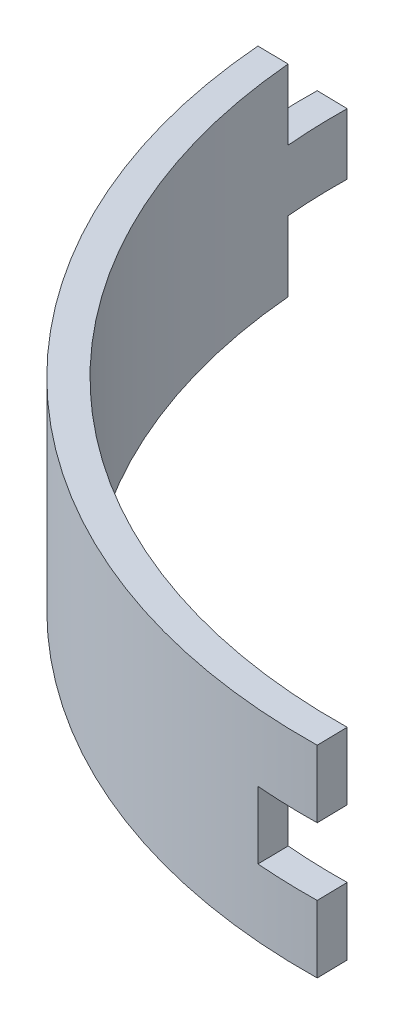
ISO-10303-21;
HEADER;
FILE_DESCRIPTION(('STEP AP214'),'2;1');
FILE_NAME('part.step','',(''),(''),'','','');
FILE_SCHEMA(('AUTOMOTIVE_DESIGN { 1 0 10303 214 1 1 1 1 }'));
ENDSEC;
DATA;
#1=APPLICATION_CONTEXT('core data for automotive mechanical design processes');
#2=APPLICATION_PROTOCOL_DEFINITION('international standard','automotive_design',2000,#1);
#3=PRODUCT_CONTEXT('',#1,'mechanical');
#4=PRODUCT('Part','Part','',(#3));
#5=PRODUCT_RELATED_PRODUCT_CATEGORY('part','',(#4));
#6=PRODUCT_DEFINITION_FORMATION('','',#4);
#7=PRODUCT_DEFINITION_CONTEXT('part definition',#1,'design');
#8=PRODUCT_DEFINITION('design','',#6,#7);
#9=PRODUCT_DEFINITION_SHAPE('','',#8);
#10=(LENGTH_UNIT() NAMED_UNIT(*) SI_UNIT(.MILLI.,.METRE.));
#11=(NAMED_UNIT(*) PLANE_ANGLE_UNIT() SI_UNIT($,.RADIAN.));
#12=(NAMED_UNIT(*) SI_UNIT($,.STERADIAN.) SOLID_ANGLE_UNIT());
#13=UNCERTAINTY_MEASURE_WITH_UNIT(LENGTH_MEASURE(1.E-05),#10,'distance_accuracy_value','');
#14=(GEOMETRIC_REPRESENTATION_CONTEXT(3) GLOBAL_UNCERTAINTY_ASSIGNED_CONTEXT((#13)) GLOBAL_UNIT_ASSIGNED_CONTEXT((#10,
#11,#12)) REPRESENTATION_CONTEXT('',''));
#15=CARTESIAN_POINT('',(0.,0.,0.));
#16=DIRECTION('',(0.,0.,1.));
#17=DIRECTION('',(1.,0.,0.));
#18=AXIS2_PLACEMENT_3D('',#15,#16,#17);
#19=CARTESIAN_POINT('',(0.,33.,0.));
#20=DIRECTION('',(0.,-1.,0.));
#21=DIRECTION('',(0.,0.,-1.));
#22=AXIS2_PLACEMENT_3D('',#19,#20,#21);
#23=CYLINDRICAL_SURFACE('',#22,102.5);
#24=DIRECTION('',(0.,-1.,0.));
#25=VECTOR('',#24,1.);
#26=CARTESIAN_POINT('',(-102.169415604373,33.,8.22560119753821));
#27=LINE('',#26,#25);
#28=CARTESIAN_POINT('',(-102.169415604373,33.,8.22560119753821));
#29=VERTEX_POINT('',#28);
#30=CARTESIAN_POINT('',(-102.169415604373,21.5,8.22560119753821));
#31=VERTEX_POINT('',#30);
#32=EDGE_CURVE('E45',#29,#31,#27,.T.);
#33=ORIENTED_EDGE('',*,*,#32,.T.);
#34=CARTESIAN_POINT('',(0.,21.5,0.));
#35=DIRECTION('',(0.,-1.,0.));
#36=DIRECTION('',(0.,0.,-1.));
#37=AXIS2_PLACEMENT_3D('',#34,#35,#36);
#38=CIRCLE('',#37,102.5);
#39=CARTESIAN_POINT('',(-102.48438875353,21.5,-1.78887165982112));
#40=VERTEX_POINT('',#39);
#41=EDGE_CURVE('E130',#31,#40,#38,.T.);
#42=ORIENTED_EDGE('',*,*,#41,.T.);
#43=DIRECTION('',(0.,-1.,0.));
#44=VECTOR('',#43,1.);
#45=CARTESIAN_POINT('',(-102.48438875353,33.,-1.78887165982112));
#46=LINE('',#45,#44);
#47=CARTESIAN_POINT('',(-102.48438875353,11.5,-1.78887165982112));
#48=VERTEX_POINT('',#47);
#49=EDGE_CURVE('E138',#40,#48,#46,.T.);
#50=ORIENTED_EDGE('',*,*,#49,.T.);
#51=CARTESIAN_POINT('',(0.,11.5,0.));
#52=DIRECTION('',(0.,-1.,0.));
#53=DIRECTION('',(0.,0.,-1.));
#54=AXIS2_PLACEMENT_3D('',#51,#52,#53);
#55=CIRCLE('',#54,102.5);
#56=CARTESIAN_POINT('',(-102.169415604373,11.5,8.22560119753821));
#57=VERTEX_POINT('',#56);
#58=EDGE_CURVE('E178',#57,#48,#55,.T.);
#59=ORIENTED_EDGE('',*,*,#58,.F.);
#60=DIRECTION('',(0.,-1.,0.));
#61=VECTOR('',#60,1.);
#62=CARTESIAN_POINT('',(-102.169415604373,33.,8.22560119753821));
#63=LINE('',#62,#61);
#64=CARTESIAN_POINT('',(-102.169415604373,0.,8.22560119753821));
#65=VERTEX_POINT('',#64);
#66=EDGE_CURVE('E167',#65,#57,#63,.F.);
#67=ORIENTED_EDGE('',*,*,#66,.F.);
#68=CARTESIAN_POINT('',(0.,0.,0.));
#69=DIRECTION('',(0.,1.,0.));
#70=DIRECTION('',(0.,0.,1.));
#71=AXIS2_PLACEMENT_3D('',#68,#69,#70);
#72=CIRCLE('',#71,102.5);
#73=CARTESIAN_POINT('',(1.78887165982157,0.,102.48438875353));
#74=VERTEX_POINT('',#73);
#75=EDGE_CURVE('E175',#65,#74,#72,.T.);
#76=ORIENTED_EDGE('',*,*,#75,.T.);
#77=DIRECTION('',(0.,-1.,0.));
#78=VECTOR('',#77,1.);
#79=CARTESIAN_POINT('',(1.78887165982157,33.,102.48438875353));
#80=LINE('',#79,#78);
#81=CARTESIAN_POINT('',(1.78887165982171,11.,102.48438875353));
#82=VERTEX_POINT('',#81);
#83=EDGE_CURVE('E154',#82,#74,#80,.T.);
#84=ORIENTED_EDGE('',*,*,#83,.F.);
#85=CARTESIAN_POINT('',(0.,11.,0.));
#86=DIRECTION('',(0.,1.,0.));
#87=DIRECTION('',(0.,0.,1.));
#88=AXIS2_PLACEMENT_3D('',#85,#86,#87);
#89=CIRCLE('',#88,102.5);
#90=CARTESIAN_POINT('',(-8.21813901558994,11.,102.170016106099));
#91=VERTEX_POINT('',#90);
#92=EDGE_CURVE('E189',#91,#82,#89,.T.);
#93=ORIENTED_EDGE('',*,*,#92,.F.);
#94=DIRECTION('',(0.,-1.,0.));
#95=VECTOR('',#94,1.);
#96=CARTESIAN_POINT('',(-8.21813901558994,33.,102.170016106099));
#97=LINE('',#96,#95);
#98=CARTESIAN_POINT('',(-8.21813901558994,22.,102.170016106099));
#99=VERTEX_POINT('',#98);
#100=EDGE_CURVE('E202',#99,#91,#97,.T.);
#101=ORIENTED_EDGE('',*,*,#100,.F.);
#102=CARTESIAN_POINT('',(0.,22.,0.));
#103=DIRECTION('',(0.,1.,0.));
#104=DIRECTION('',(0.,0.,1.));
#105=AXIS2_PLACEMENT_3D('',#102,#103,#104);
#106=CIRCLE('',#105,102.5);
#107=CARTESIAN_POINT('',(1.78887165982171,22.,102.48438875353));
#108=VERTEX_POINT('',#107);
#109=EDGE_CURVE('E184',#99,#108,#106,.T.);
#110=ORIENTED_EDGE('',*,*,#109,.T.);
#111=CARTESIAN_POINT('',(1.78887165982157,33.,102.48438875353));
#112=VERTEX_POINT('',#111);
#113=EDGE_CURVE('E155',#112,#108,#80,.T.);
#114=ORIENTED_EDGE('',*,*,#113,.F.);
#115=CARTESIAN_POINT('',(0.,33.,0.));
#116=DIRECTION('',(0.,1.,0.));
#117=DIRECTION('',(0.,0.,1.));
#118=AXIS2_PLACEMENT_3D('',#115,#116,#117);
#119=CIRCLE('',#118,102.5);
#120=EDGE_CURVE('E193',#29,#112,#119,.T.);
#121=ORIENTED_EDGE('',*,*,#120,.F.);
#122=EDGE_LOOP('',(#33,#42,#50,#59,#67,#76,#84,#93,#101,#110,#114,#121));
#123=FACE_BOUND('',#122,.T.);
#124=ADVANCED_FACE('F32',(#123),#23,.T.);
#125=CARTESIAN_POINT('',(0.,33.,0.));
#126=DIRECTION('',(0.,-1.,0.));
#127=DIRECTION('',(0.,0.,-1.));
#128=AXIS2_PLACEMENT_3D('',#125,#126,#127);
#129=CYLINDRICAL_SURFACE('',#128,97.5);
#130=CARTESIAN_POINT('',(0.,21.5,0.));
#131=DIRECTION('',(0.,-1.,0.));
#132=DIRECTION('',(0.,0.,-1.));
#133=AXIS2_PLACEMENT_3D('',#130,#131,#132);
#134=CIRCLE('',#133,97.5);
#135=CARTESIAN_POINT('',(-97.1449380063492,21.5,8.31330378024206));
#136=VERTEX_POINT('',#135);
#137=CARTESIAN_POINT('',(-97.4851502777482,21.5,-1.70160962763472));
#138=VERTEX_POINT('',#137);
#139=EDGE_CURVE('E121',#136,#138,#134,.T.);
#140=ORIENTED_EDGE('',*,*,#139,.F.);
#141=DIRECTION('',(0.,-1.,0.));
#142=VECTOR('',#141,1.);
#143=CARTESIAN_POINT('',(-97.1449380063492,33.,8.31330378024207));
#144=LINE('',#143,#142);
#145=CARTESIAN_POINT('',(-97.1449380063492,33.,8.31330378024206));
#146=VERTEX_POINT('',#145);
#147=EDGE_CURVE('E139',#146,#136,#144,.T.);
#148=ORIENTED_EDGE('',*,*,#147,.F.);
#149=CARTESIAN_POINT('',(0.,33.,0.));
#150=DIRECTION('',(0.,1.,0.));
#151=DIRECTION('',(0.,0.,1.));
#152=AXIS2_PLACEMENT_3D('',#149,#150,#151);
#153=CIRCLE('',#152,97.5);
#154=CARTESIAN_POINT('',(1.70160962763512,33.,97.4851502777482));
#155=VERTEX_POINT('',#154);
#156=EDGE_CURVE('E149',#146,#155,#153,.T.);
#157=ORIENTED_EDGE('',*,*,#156,.T.);
#158=DIRECTION('',(0.,-1.,0.));
#159=VECTOR('',#158,1.);
#160=CARTESIAN_POINT('',(1.70160962763512,33.,97.4851502777482));
#161=LINE('',#160,#159);
#162=CARTESIAN_POINT('',(1.70160962763528,22.,97.4851502777482));
#163=VERTEX_POINT('',#162);
#164=EDGE_CURVE('E147',#155,#163,#161,.T.);
#165=ORIENTED_EDGE('',*,*,#164,.T.);
#166=CARTESIAN_POINT('',(0.,22.,0.));
#167=DIRECTION('',(0.,1.,0.));
#168=DIRECTION('',(0.,0.,1.));
#169=AXIS2_PLACEMENT_3D('',#166,#167,#168);
#170=CIRCLE('',#169,97.5);
#171=CARTESIAN_POINT('',(-8.30584093758575,22.,97.1455763600152));
#172=VERTEX_POINT('',#171);
#173=EDGE_CURVE('E164',#172,#163,#170,.T.);
#174=ORIENTED_EDGE('',*,*,#173,.F.);
#175=DIRECTION('',(0.,-1.,0.));
#176=VECTOR('',#175,1.);
#177=CARTESIAN_POINT('',(-8.30584093758575,33.,97.1455763600152));
#178=LINE('',#177,#176);
#179=CARTESIAN_POINT('',(-8.30584093758575,11.,97.1455763600152));
#180=VERTEX_POINT('',#179);
#181=EDGE_CURVE('E158',#172,#180,#178,.T.);
#182=ORIENTED_EDGE('',*,*,#181,.T.);
#183=CARTESIAN_POINT('',(0.,11.,0.));
#184=DIRECTION('',(0.,1.,0.));
#185=DIRECTION('',(0.,0.,1.));
#186=AXIS2_PLACEMENT_3D('',#183,#184,#185);
#187=CIRCLE('',#186,97.5);
#188=CARTESIAN_POINT('',(1.70160962763528,11.,97.4851502777482));
#189=VERTEX_POINT('',#188);
#190=EDGE_CURVE('E161',#180,#189,#187,.T.);
#191=ORIENTED_EDGE('',*,*,#190,.T.);
#192=CARTESIAN_POINT('',(1.70160962763512,0.,97.4851502777482));
#193=VERTEX_POINT('',#192);
#194=EDGE_CURVE('E144',#189,#193,#161,.T.);
#195=ORIENTED_EDGE('',*,*,#194,.T.);
#196=CARTESIAN_POINT('',(0.,0.,0.));
#197=DIRECTION('',(0.,1.,0.));
#198=DIRECTION('',(0.,0.,1.));
#199=AXIS2_PLACEMENT_3D('',#196,#197,#198);
#200=CIRCLE('',#199,97.5);
#201=CARTESIAN_POINT('',(-97.1449380063492,0.,8.31330378024207));
#202=VERTEX_POINT('',#201);
#203=EDGE_CURVE('E186',#202,#193,#200,.T.);
#204=ORIENTED_EDGE('',*,*,#203,.F.);
#205=DIRECTION('',(0.,-1.,0.));
#206=VECTOR('',#205,1.);
#207=CARTESIAN_POINT('',(-97.1449380063492,33.,8.31330378024206));
#208=LINE('',#207,#206);
#209=CARTESIAN_POINT('',(-97.1449380063492,11.5,8.31330378024206));
#210=VERTEX_POINT('',#209);
#211=EDGE_CURVE('E53',#202,#210,#208,.F.);
#212=ORIENTED_EDGE('',*,*,#211,.T.);
#213=CARTESIAN_POINT('',(0.,11.5,0.));
#214=DIRECTION('',(0.,-1.,0.));
#215=DIRECTION('',(0.,0.,-1.));
#216=AXIS2_PLACEMENT_3D('',#213,#214,#215);
#217=CIRCLE('',#216,97.5);
#218=CARTESIAN_POINT('',(-97.4851502777482,11.5,-1.70160962763472));
#219=VERTEX_POINT('',#218);
#220=EDGE_CURVE('E143',#210,#219,#217,.T.);
#221=ORIENTED_EDGE('',*,*,#220,.T.);
#222=DIRECTION('',(0.,-1.,0.));
#223=VECTOR('',#222,1.);
#224=CARTESIAN_POINT('',(-97.4851502777482,33.,-1.70160962763472));
#225=LINE('',#224,#223);
#226=EDGE_CURVE('E136',#138,#219,#225,.T.);
#227=ORIENTED_EDGE('',*,*,#226,.F.);
#228=EDGE_LOOP('',(#140,#148,#157,#165,#174,#182,#191,#195,#204,#212,#221,#227));
#229=FACE_BOUND('',#228,.T.);
#230=ADVANCED_FACE('F142',(#229),#129,.F.);
#231=CARTESIAN_POINT('',(-97.4851502777482,33.,-1.70160962763472));
#232=DIRECTION('',(-0.0174524064372792,0.,0.999847695156391));
#233=DIRECTION('',(0.999847695156391,0.,0.0174524064372792));
#234=AXIS2_PLACEMENT_3D('',#231,#232,#233);
#235=PLANE('',#234);
#236=ORIENTED_EDGE('',*,*,#49,.F.);
#237=DIRECTION('',(-0.999847695156391,0.,-0.0174524064372792));
#238=VECTOR('',#237,1.);
#239=CARTESIAN_POINT('',(-94.0318288913808,21.5,-1.64133167861769));
#240=LINE('',#239,#238);
#241=EDGE_CURVE('E124',#138,#40,#240,.T.);
#242=ORIENTED_EDGE('',*,*,#241,.F.);
#243=ORIENTED_EDGE('',*,*,#226,.T.);
#244=DIRECTION('',(-0.999847695156391,0.,-0.0174524064372792));
#245=VECTOR('',#244,1.);
#246=CARTESIAN_POINT('',(0.,11.5,0.));
#247=LINE('',#246,#245);
#248=EDGE_CURVE('E219',#219,#48,#247,.T.);
#249=ORIENTED_EDGE('',*,*,#248,.T.);
#250=EDGE_LOOP('',(#236,#242,#243,#249));
#251=FACE_BOUND('',#250,.T.);
#252=ADVANCED_FACE('F134',(#251),#235,.F.);
#253=CARTESIAN_POINT('',(0.,0.,0.));
#254=DIRECTION('',(0.,1.,0.));
#255=DIRECTION('',(0.,0.,1.));
#256=AXIS2_PLACEMENT_3D('',#253,#254,#255);
#257=PLANE('',#256);
#258=DIRECTION('',(-0.999847695156391,0.,-0.0174524064372792));
#259=VECTOR('',#258,1.);
#260=CARTESIAN_POINT('',(-0.174654094665217,0.,10.0059263820278));
#261=LINE('',#260,#259);
#262=EDGE_CURVE('E39',#202,#65,#261,.T.);
#263=ORIENTED_EDGE('',*,*,#262,.F.);
#264=ORIENTED_EDGE('',*,*,#203,.T.);
#265=DIRECTION('',(-0.017452406437285,0.,-0.999847695156391));
#266=VECTOR('',#265,1.);
#267=CARTESIAN_POINT('',(1.78887165982157,0.,102.48438875353));
#268=LINE('',#267,#266);
#269=EDGE_CURVE('E183',#74,#193,#268,.T.);
#270=ORIENTED_EDGE('',*,*,#269,.F.);
#271=ORIENTED_EDGE('',*,*,#75,.F.);
#272=EDGE_LOOP('',(#263,#264,#270,#271));
#273=FACE_BOUND('',#272,.T.);
#274=ADVANCED_FACE('F181',(#273),#257,.F.);
#275=CARTESIAN_POINT('',(1.78887165982157,33.,102.48438875353));
#276=DIRECTION('',(-0.999847695156391,0.,0.017452406437285));
#277=DIRECTION('',(0.017452406437285,0.,0.999847695156391));
#278=AXIS2_PLACEMENT_3D('',#275,#276,#277);
#279=PLANE('',#278);
#280=DIRECTION('',(0.017452406437285,0.,0.999847695156391));
#281=VECTOR('',#280,1.);
#282=CARTESIAN_POINT('',(1.65626004977408,11.,94.8870747021088));
#283=LINE('',#282,#281);
#284=EDGE_CURVE('E205',#189,#82,#283,.T.);
#285=ORIENTED_EDGE('',*,*,#284,.T.);
#286=ORIENTED_EDGE('',*,*,#83,.T.);
#287=ORIENTED_EDGE('',*,*,#269,.T.);
#288=ORIENTED_EDGE('',*,*,#194,.F.);
#289=EDGE_LOOP('',(#285,#286,#287,#288));
#290=FACE_BOUND('',#289,.T.);
#291=ADVANCED_FACE('F246',(#290),#279,.F.);
#292=ORIENTED_EDGE('',*,*,#113,.T.);
#293=DIRECTION('',(0.017452406437285,0.,0.999847695156391));
#294=VECTOR('',#293,1.);
#295=CARTESIAN_POINT('',(1.65626004977408,22.,94.8870747021088));
#296=LINE('',#295,#294);
#297=EDGE_CURVE('E209',#163,#108,#296,.T.);
#298=ORIENTED_EDGE('',*,*,#297,.F.);
#299=ORIENTED_EDGE('',*,*,#164,.F.);
#300=DIRECTION('',(-0.017452406437285,0.,-0.999847695156391));
#301=VECTOR('',#300,1.);
#302=CARTESIAN_POINT('',(1.78887165982157,33.,102.48438875353));
#303=LINE('',#302,#301);
#304=EDGE_CURVE('E194',#112,#155,#303,.T.);
#305=ORIENTED_EDGE('',*,*,#304,.F.);
#306=EDGE_LOOP('',(#292,#298,#299,#305));
#307=FACE_BOUND('',#306,.T.);
#308=ADVANCED_FACE('F230',(#307),#279,.F.);
#309=CARTESIAN_POINT('',(0.,33.,0.));
#310=DIRECTION('',(0.,1.,0.));
#311=DIRECTION('',(0.,0.,1.));
#312=AXIS2_PLACEMENT_3D('',#309,#310,#311);
#313=PLANE('',#312);
#314=DIRECTION('',(0.999847695156391,0.,0.0174524064372792));
#315=VECTOR('',#314,1.);
#316=CARTESIAN_POINT('',(-0.174654094665217,33.,10.0059263820278));
#317=LINE('',#316,#315);
#318=EDGE_CURVE('E11',#29,#146,#317,.T.);
#319=ORIENTED_EDGE('',*,*,#318,.F.);
#320=ORIENTED_EDGE('',*,*,#120,.T.);
#321=ORIENTED_EDGE('',*,*,#304,.T.);
#322=ORIENTED_EDGE('',*,*,#156,.F.);
#323=EDGE_LOOP('',(#319,#320,#321,#322));
#324=FACE_BOUND('',#323,.T.);
#325=ADVANCED_FACE('F233',(#324),#313,.T.);
#326=CARTESIAN_POINT('',(-8.34221690178983,22.,95.0615987664817));
#327=DIRECTION('',(0.,1.,0.));
#328=DIRECTION('',(0.,0.,1.));
#329=AXIS2_PLACEMENT_3D('',#326,#327,#328);
#330=PLANE('',#329);
#331=DIRECTION('',(0.017452406437285,0.,0.999847695156391));
#332=VECTOR('',#331,1.);
#333=CARTESIAN_POINT('',(-8.34221690178983,22.,95.0615987664817));
#334=LINE('',#333,#332);
#335=EDGE_CURVE('E208',#172,#99,#334,.T.);
#336=ORIENTED_EDGE('',*,*,#335,.F.);
#337=ORIENTED_EDGE('',*,*,#173,.T.);
#338=ORIENTED_EDGE('',*,*,#297,.T.);
#339=ORIENTED_EDGE('',*,*,#109,.F.);
#340=EDGE_LOOP('',(#336,#337,#338,#339));
#341=FACE_BOUND('',#340,.T.);
#342=ADVANCED_FACE('F237',(#341),#330,.F.);
#343=CARTESIAN_POINT('',(-8.34221690178983,11.,95.0615987664817));
#344=DIRECTION('',(0.,1.,0.));
#345=DIRECTION('',(0.,0.,1.));
#346=AXIS2_PLACEMENT_3D('',#343,#344,#345);
#347=PLANE('',#346);
#348=ORIENTED_EDGE('',*,*,#92,.T.);
#349=ORIENTED_EDGE('',*,*,#284,.F.);
#350=ORIENTED_EDGE('',*,*,#190,.F.);
#351=DIRECTION('',(0.017452406437285,0.,0.999847695156391));
#352=VECTOR('',#351,1.);
#353=CARTESIAN_POINT('',(-8.34221690178983,11.,95.0615987664817));
#354=LINE('',#353,#352);
#355=EDGE_CURVE('E204',#180,#91,#354,.T.);
#356=ORIENTED_EDGE('',*,*,#355,.T.);
#357=EDGE_LOOP('',(#348,#349,#350,#356));
#358=FACE_BOUND('',#357,.T.);
#359=ADVANCED_FACE('F242',(#358),#347,.T.);
#360=CARTESIAN_POINT('',(-9.99847695156391,0.,0.17452406437285));
#361=DIRECTION('',(0.999847695156391,0.,-0.017452406437285));
#362=DIRECTION('',(-0.017452406437285,0.,-0.999847695156391));
#363=AXIS2_PLACEMENT_3D('',#360,#361,#362);
#364=PLANE('',#363);
#365=ORIENTED_EDGE('',*,*,#100,.T.);
#366=ORIENTED_EDGE('',*,*,#355,.F.);
#367=ORIENTED_EDGE('',*,*,#181,.F.);
#368=ORIENTED_EDGE('',*,*,#335,.T.);
#369=EDGE_LOOP('',(#365,#366,#367,#368));
#370=FACE_BOUND('',#369,.T.);
#371=ADVANCED_FACE('F239',(#370),#364,.T.);
#372=CARTESIAN_POINT('',(-0.174654094665217,11.5,10.0059263820278));
#373=DIRECTION('',(0.,-1.,0.));
#374=DIRECTION('',(0.,0.,-1.));
#375=AXIS2_PLACEMENT_3D('',#372,#373,#374);
#376=PLANE('',#375);
#377=ORIENTED_EDGE('',*,*,#58,.T.);
#378=ORIENTED_EDGE('',*,*,#248,.F.);
#379=ORIENTED_EDGE('',*,*,#220,.F.);
#380=DIRECTION('',(-0.999847695156391,0.,-0.0174524064372792));
#381=VECTOR('',#380,1.);
#382=CARTESIAN_POINT('',(-0.174654094665217,11.5,10.0059263820278));
#383=LINE('',#382,#381);
#384=EDGE_CURVE('E218',#210,#57,#383,.T.);
#385=ORIENTED_EDGE('',*,*,#384,.T.);
#386=EDGE_LOOP('',(#377,#378,#379,#385));
#387=FACE_BOUND('',#386,.T.);
#388=ADVANCED_FACE('F271',(#387),#376,.T.);
#389=CARTESIAN_POINT('',(-0.174654094665217,0.,10.0059263820278));
#390=DIRECTION('',(0.0174524064372792,0.,-0.999847695156391));
#391=DIRECTION('',(-0.999847695156391,0.,-0.0174524064372792));
#392=AXIS2_PLACEMENT_3D('',#389,#390,#391);
#393=PLANE('',#392);
#394=ORIENTED_EDGE('',*,*,#66,.T.);
#395=ORIENTED_EDGE('',*,*,#384,.F.);
#396=ORIENTED_EDGE('',*,*,#211,.F.);
#397=ORIENTED_EDGE('',*,*,#262,.T.);
#398=EDGE_LOOP('',(#394,#395,#396,#397));
#399=FACE_BOUND('',#398,.T.);
#400=ADVANCED_FACE('F166',(#399),#393,.T.);
#401=CARTESIAN_POINT('',(-94.206482986046,21.5,8.36459470341009));
#402=DIRECTION('',(0.,-1.,0.));
#403=DIRECTION('',(0.,0.,-1.));
#404=AXIS2_PLACEMENT_3D('',#401,#402,#403);
#405=PLANE('',#404);
#406=DIRECTION('',(-0.999847695156391,0.,-0.0174524064372792));
#407=VECTOR('',#406,1.);
#408=CARTESIAN_POINT('',(-94.206482986046,21.5,8.36459470341009));
#409=LINE('',#408,#407);
#410=EDGE_CURVE('E126',#136,#31,#409,.T.);
#411=ORIENTED_EDGE('',*,*,#410,.F.);
#412=ORIENTED_EDGE('',*,*,#139,.T.);
#413=ORIENTED_EDGE('',*,*,#241,.T.);
#414=ORIENTED_EDGE('',*,*,#41,.F.);
#415=EDGE_LOOP('',(#411,#412,#413,#414));
#416=FACE_BOUND('',#415,.T.);
#417=ADVANCED_FACE('F123',(#416),#405,.F.);
#418=CARTESIAN_POINT('',(-0.174654094665217,0.,10.0059263820278));
#419=DIRECTION('',(-0.0174524064372792,0.,0.999847695156391));
#420=DIRECTION('',(0.999847695156391,0.,0.0174524064372792));
#421=AXIS2_PLACEMENT_3D('',#418,#419,#420);
#422=PLANE('',#421);
#423=ORIENTED_EDGE('',*,*,#318,.T.);
#424=ORIENTED_EDGE('',*,*,#147,.T.);
#425=ORIENTED_EDGE('',*,*,#410,.T.);
#426=ORIENTED_EDGE('',*,*,#32,.F.);
#427=EDGE_LOOP('',(#423,#424,#425,#426));
#428=FACE_BOUND('',#427,.T.);
#429=ADVANCED_FACE('F225',(#428),#422,.F.);
#430=CLOSED_SHELL('',(#124,#230,#252,#274,#291,#308,#325,#342,#359,#371,#388,#400,#417,#429));
#431=MANIFOLD_SOLID_BREP('B2',#430);
#432=ADVANCED_BREP_SHAPE_REPRESENTATION('',(#18,#431),#14);
#433=SHAPE_DEFINITION_REPRESENTATION(#9,#432);
ENDSEC;
END-ISO-10303-21;
